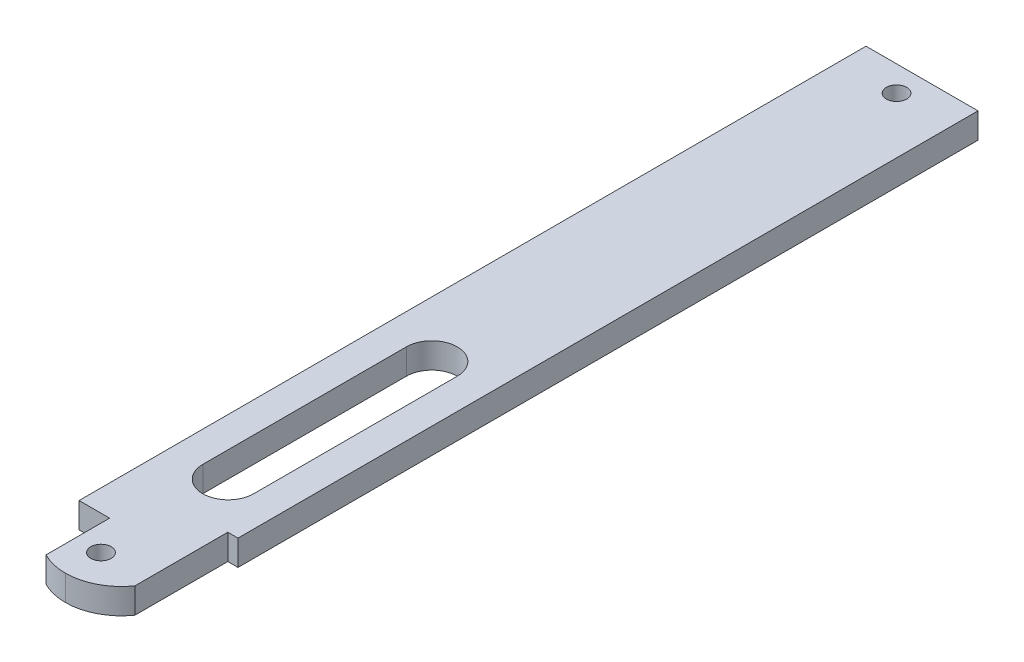
ISO-10303-21;
HEADER;
FILE_DESCRIPTION(('STEP AP214'),'2;1');
FILE_NAME('part.step','',(''),(''),'','','');
FILE_SCHEMA(('AUTOMOTIVE_DESIGN { 1 0 10303 214 1 1 1 1 }'));
ENDSEC;
DATA;
#1=APPLICATION_CONTEXT('core data for automotive mechanical design processes');
#2=APPLICATION_PROTOCOL_DEFINITION('international standard','automotive_design',2000,#1);
#3=PRODUCT_CONTEXT('',#1,'mechanical');
#4=PRODUCT('Part','Part','',(#3));
#5=PRODUCT_RELATED_PRODUCT_CATEGORY('part','',(#4));
#6=PRODUCT_DEFINITION_FORMATION('','',#4);
#7=PRODUCT_DEFINITION_CONTEXT('part definition',#1,'design');
#8=PRODUCT_DEFINITION('design','',#6,#7);
#9=PRODUCT_DEFINITION_SHAPE('','',#8);
#10=(LENGTH_UNIT() NAMED_UNIT(*) SI_UNIT(.MILLI.,.METRE.));
#11=(NAMED_UNIT(*) PLANE_ANGLE_UNIT() SI_UNIT($,.RADIAN.));
#12=(NAMED_UNIT(*) SI_UNIT($,.STERADIAN.) SOLID_ANGLE_UNIT());
#13=UNCERTAINTY_MEASURE_WITH_UNIT(LENGTH_MEASURE(1.E-05),#10,'distance_accuracy_value','');
#14=(GEOMETRIC_REPRESENTATION_CONTEXT(3) GLOBAL_UNCERTAINTY_ASSIGNED_CONTEXT((#13)) GLOBAL_UNIT_ASSIGNED_CONTEXT((#10,
#11,#12)) REPRESENTATION_CONTEXT('',''));
#15=CARTESIAN_POINT('',(0.,0.,0.));
#16=DIRECTION('',(0.,0.,1.));
#17=DIRECTION('',(1.,0.,0.));
#18=AXIS2_PLACEMENT_3D('',#15,#16,#17);
#19=CARTESIAN_POINT('',(0.,5.,0.));
#20=DIRECTION('',(-1.,0.,0.));
#21=DIRECTION('',(0.,0.,1.));
#22=AXIS2_PLACEMENT_3D('',#19,#20,#21);
#23=PLANE('',#22);
#24=DIRECTION('',(0.,-1.,0.));
#25=VECTOR('',#24,1.);
#26=CARTESIAN_POINT('',(0.,0.,-11.6998848399623));
#27=LINE('',#26,#25);
#28=CARTESIAN_POINT('',(0.,5.,-11.6998848399623));
#29=VERTEX_POINT('',#28);
#30=CARTESIAN_POINT('',(0.,0.,-11.6998848399623));
#31=VERTEX_POINT('',#30);
#32=EDGE_CURVE('E214',#29,#31,#27,.T.);
#33=ORIENTED_EDGE('',*,*,#32,.F.);
#34=DIRECTION('',(0.,0.,-1.));
#35=VECTOR('',#34,1.);
#36=CARTESIAN_POINT('',(0.,5.,0.));
#37=LINE('',#36,#35);
#38=CARTESIAN_POINT('',(0.,5.,-166.3));
#39=VERTEX_POINT('',#38);
#40=EDGE_CURVE('E270',#29,#39,#37,.T.);
#41=ORIENTED_EDGE('',*,*,#40,.T.);
#42=DIRECTION('',(0.,-1.,0.));
#43=VECTOR('',#42,1.);
#44=CARTESIAN_POINT('',(0.,5.,-166.3));
#45=LINE('',#44,#43);
#46=CARTESIAN_POINT('',(0.,0.,-166.3));
#47=VERTEX_POINT('',#46);
#48=EDGE_CURVE('E275',#39,#47,#45,.T.);
#49=ORIENTED_EDGE('',*,*,#48,.T.);
#50=DIRECTION('',(0.,0.,-1.));
#51=VECTOR('',#50,1.);
#52=CARTESIAN_POINT('',(0.,0.,0.));
#53=LINE('',#52,#51);
#54=EDGE_CURVE('E283',#31,#47,#53,.T.);
#55=ORIENTED_EDGE('',*,*,#54,.F.);
#56=EDGE_LOOP('',(#33,#41,#49,#55));
#57=FACE_BOUND('',#56,.T.);
#58=ADVANCED_FACE('F95',(#57),#23,.T.);
#59=CARTESIAN_POINT('',(22.,5.,0.));
#60=DIRECTION('',(-1.,0.,0.));
#61=DIRECTION('',(0.,0.,1.));
#62=AXIS2_PLACEMENT_3D('',#59,#60,#61);
#63=PLANE('',#62);
#64=DIRECTION('',(0.,0.,-1.));
#65=VECTOR('',#64,1.);
#66=CARTESIAN_POINT('',(22.,5.,0.));
#67=LINE('',#66,#65);
#68=CARTESIAN_POINT('',(22.,5.,-20.917059784221));
#69=VERTEX_POINT('',#68);
#70=CARTESIAN_POINT('',(22.,5.,-166.3));
#71=VERTEX_POINT('',#70);
#72=EDGE_CURVE('E264',#69,#71,#67,.T.);
#73=ORIENTED_EDGE('',*,*,#72,.F.);
#74=DIRECTION('',(0.,1.,0.));
#75=VECTOR('',#74,1.);
#76=CARTESIAN_POINT('',(22.,5.,-20.917059784221));
#77=LINE('',#76,#75);
#78=CARTESIAN_POINT('',(22.,0.,-20.917059784221));
#79=VERTEX_POINT('',#78);
#80=EDGE_CURVE('E196',#79,#69,#77,.T.);
#81=ORIENTED_EDGE('',*,*,#80,.F.);
#82=DIRECTION('',(0.,0.,-1.));
#83=VECTOR('',#82,1.);
#84=CARTESIAN_POINT('',(22.,0.,0.));
#85=LINE('',#84,#83);
#86=CARTESIAN_POINT('',(22.,0.,-166.3));
#87=VERTEX_POINT('',#86);
#88=EDGE_CURVE('E278',#79,#87,#85,.T.);
#89=ORIENTED_EDGE('',*,*,#88,.T.);
#90=DIRECTION('',(0.,-1.,0.));
#91=VECTOR('',#90,1.);
#92=CARTESIAN_POINT('',(22.,5.,-166.3));
#93=LINE('',#92,#91);
#94=EDGE_CURVE('E289',#71,#87,#93,.T.);
#95=ORIENTED_EDGE('',*,*,#94,.F.);
#96=EDGE_LOOP('',(#73,#81,#89,#95));
#97=FACE_BOUND('',#96,.T.);
#98=ADVANCED_FACE('F317',(#97),#63,.F.);
#99=CARTESIAN_POINT('',(0.,0.,0.));
#100=DIRECTION('',(0.,1.,0.));
#101=DIRECTION('',(0.,0.,1.));
#102=AXIS2_PLACEMENT_3D('',#99,#100,#101);
#103=PLANE('',#102);
#104=CARTESIAN_POINT('',(11.,0.,-5.));
#105=DIRECTION('',(0.,1.,0.));
#106=DIRECTION('',(0.,0.,1.));
#107=AXIS2_PLACEMENT_3D('',#104,#105,#106);
#108=CIRCLE('',#107,2.);
#109=CARTESIAN_POINT('',(11.,0.,-3.));
#110=VERTEX_POINT('',#109);
#111=EDGE_CURVE('E265',#110,#110,#108,.T.);
#112=ORIENTED_EDGE('',*,*,#111,.T.);
#113=EDGE_LOOP('',(#112));
#114=FACE_BOUND('',#113,.T.);
#115=CARTESIAN_POINT('',(11.,0.,-161.3));
#116=DIRECTION('',(0.,1.,0.));
#117=DIRECTION('',(0.,0.,1.));
#118=AXIS2_PLACEMENT_3D('',#115,#116,#117);
#119=CIRCLE('',#118,2.);
#120=CARTESIAN_POINT('',(11.,0.,-159.3));
#121=VERTEX_POINT('',#120);
#122=EDGE_CURVE('E254',#121,#121,#119,.T.);
#123=ORIENTED_EDGE('',*,*,#122,.T.);
#124=EDGE_LOOP('',(#123));
#125=FACE_BOUND('',#124,.T.);
#126=CARTESIAN_POINT('',(11.,0.,-70.));
#127=DIRECTION('',(0.,-1.,0.));
#128=DIRECTION('',(0.,0.,-1.));
#129=AXIS2_PLACEMENT_3D('',#126,#127,#128);
#130=CIRCLE('',#129,5.);
#131=CARTESIAN_POINT('',(6.,0.,-70.));
#132=VERTEX_POINT('',#131);
#133=CARTESIAN_POINT('',(16.,0.,-70.));
#134=VERTEX_POINT('',#133);
#135=EDGE_CURVE('E244',#132,#134,#130,.T.);
#136=ORIENTED_EDGE('',*,*,#135,.F.);
#137=DIRECTION('',(0.,0.,-1.));
#138=VECTOR('',#137,1.);
#139=CARTESIAN_POINT('',(6.,0.,0.));
#140=LINE('',#139,#138);
#141=CARTESIAN_POINT('',(6.,0.,-30.));
#142=VERTEX_POINT('',#141);
#143=EDGE_CURVE('E242',#142,#132,#140,.T.);
#144=ORIENTED_EDGE('',*,*,#143,.F.);
#145=CARTESIAN_POINT('',(11.,0.,-30.));
#146=DIRECTION('',(0.,-1.,0.));
#147=DIRECTION('',(0.,0.,-1.));
#148=AXIS2_PLACEMENT_3D('',#145,#146,#147);
#149=CIRCLE('',#148,5.);
#150=CARTESIAN_POINT('',(16.,0.,-30.));
#151=VERTEX_POINT('',#150);
#152=EDGE_CURVE('E232',#151,#142,#149,.T.);
#153=ORIENTED_EDGE('',*,*,#152,.F.);
#154=DIRECTION('',(0.,0.,-1.));
#155=VECTOR('',#154,1.);
#156=CARTESIAN_POINT('',(16.,0.,0.));
#157=LINE('',#156,#155);
#158=EDGE_CURVE('E247',#151,#134,#157,.T.);
#159=ORIENTED_EDGE('',*,*,#158,.T.);
#160=EDGE_LOOP('',(#136,#144,#153,#159));
#161=FACE_BOUND('',#160,.T.);
#162=ORIENTED_EDGE('',*,*,#88,.F.);
#163=DIRECTION('',(1.,0.,0.));
#164=VECTOR('',#163,1.);
#165=CARTESIAN_POINT('',(20.,0.,-20.917059784221));
#166=LINE('',#165,#164);
#167=CARTESIAN_POINT('',(20.,0.,-20.917059784221));
#168=VERTEX_POINT('',#167);
#169=EDGE_CURVE('E199',#168,#79,#166,.T.);
#170=ORIENTED_EDGE('',*,*,#169,.F.);
#171=DIRECTION('',(0.,0.,-1.));
#172=VECTOR('',#171,1.);
#173=CARTESIAN_POINT('',(20.,0.,-20.917059784221));
#174=LINE('',#173,#172);
#175=CARTESIAN_POINT('',(20.,0.,-2.67544467966324));
#176=VERTEX_POINT('',#175);
#177=EDGE_CURVE('E200',#176,#168,#174,.T.);
#178=ORIENTED_EDGE('',*,*,#177,.F.);
#179=CARTESIAN_POINT('',(11.,0.,-9.));
#180=DIRECTION('',(0.,1.,0.));
#181=DIRECTION('',(0.,0.,1.));
#182=AXIS2_PLACEMENT_3D('',#179,#180,#181);
#183=CIRCLE('',#182,11.);
#184=CARTESIAN_POINT('',(11.,0.,2.));
#185=VERTEX_POINT('',#184);
#186=EDGE_CURVE('E292',#176,#185,#183,.F.);
#187=ORIENTED_EDGE('',*,*,#186,.T.);
#188=CARTESIAN_POINT('',(11.,0.,-9.));
#189=DIRECTION('',(0.,1.,0.));
#190=DIRECTION('',(0.,0.,1.));
#191=AXIS2_PLACEMENT_3D('',#188,#189,#190);
#192=CIRCLE('',#191,11.);
#193=CARTESIAN_POINT('',(6.,0.,0.797958971132712));
#194=VERTEX_POINT('',#193);
#195=EDGE_CURVE('E294',#185,#194,#192,.F.);
#196=ORIENTED_EDGE('',*,*,#195,.T.);
#197=DIRECTION('',(0.,0.,1.));
#198=VECTOR('',#197,1.);
#199=CARTESIAN_POINT('',(6.,0.,-11.6998848399623));
#200=LINE('',#199,#198);
#201=CARTESIAN_POINT('',(6.,0.,-11.6998848399623));
#202=VERTEX_POINT('',#201);
#203=EDGE_CURVE('E117',#202,#194,#200,.T.);
#204=ORIENTED_EDGE('',*,*,#203,.F.);
#205=DIRECTION('',(-1.,0.,0.));
#206=VECTOR('',#205,1.);
#207=CARTESIAN_POINT('',(6.,0.,-11.6998848399623));
#208=LINE('',#207,#206);
#209=EDGE_CURVE('E221',#202,#31,#208,.T.);
#210=ORIENTED_EDGE('',*,*,#209,.T.);
#211=ORIENTED_EDGE('',*,*,#54,.T.);
#212=DIRECTION('',(1.,0.,0.));
#213=VECTOR('',#212,1.);
#214=CARTESIAN_POINT('',(0.,0.,-166.3));
#215=LINE('',#214,#213);
#216=EDGE_CURVE('E280',#47,#87,#215,.T.);
#217=ORIENTED_EDGE('',*,*,#216,.T.);
#218=EDGE_LOOP('',(#162,#170,#178,#187,#196,#204,#210,#211,#217));
#219=FACE_BOUND('',#218,.T.);
#220=ADVANCED_FACE('F315',(#114,#125,#161,#219),#103,.F.);
#221=CARTESIAN_POINT('',(0.,5.,0.));
#222=DIRECTION('',(0.,1.,0.));
#223=DIRECTION('',(0.,0.,1.));
#224=AXIS2_PLACEMENT_3D('',#221,#222,#223);
#225=PLANE('',#224);
#226=DIRECTION('',(1.,0.,0.));
#227=VECTOR('',#226,1.);
#228=CARTESIAN_POINT('',(20.,5.,-20.917059784221));
#229=LINE('',#228,#227);
#230=CARTESIAN_POINT('',(20.,5.,-20.917059784221));
#231=VERTEX_POINT('',#230);
#232=EDGE_CURVE('E191',#231,#69,#229,.T.);
#233=ORIENTED_EDGE('',*,*,#232,.T.);
#234=ORIENTED_EDGE('',*,*,#72,.T.);
#235=DIRECTION('',(1.,0.,0.));
#236=VECTOR('',#235,1.);
#237=CARTESIAN_POINT('',(0.,5.,-166.3));
#238=LINE('',#237,#236);
#239=EDGE_CURVE('E267',#39,#71,#238,.T.);
#240=ORIENTED_EDGE('',*,*,#239,.F.);
#241=ORIENTED_EDGE('',*,*,#40,.F.);
#242=DIRECTION('',(-1.,0.,0.));
#243=VECTOR('',#242,1.);
#244=CARTESIAN_POINT('',(6.,5.,-11.6998848399623));
#245=LINE('',#244,#243);
#246=CARTESIAN_POINT('',(6.,5.,-11.6998848399623));
#247=VERTEX_POINT('',#246);
#248=EDGE_CURVE('E223',#247,#29,#245,.T.);
#249=ORIENTED_EDGE('',*,*,#248,.F.);
#250=DIRECTION('',(0.,0.,-1.));
#251=VECTOR('',#250,1.);
#252=CARTESIAN_POINT('',(6.,5.,-11.6998848399623));
#253=LINE('',#252,#251);
#254=CARTESIAN_POINT('',(6.,5.,0.797958971132714));
#255=VERTEX_POINT('',#254);
#256=EDGE_CURVE('E219',#255,#247,#253,.T.);
#257=ORIENTED_EDGE('',*,*,#256,.F.);
#258=CARTESIAN_POINT('',(11.,5.,-9.));
#259=DIRECTION('',(0.,1.,0.));
#260=DIRECTION('',(0.,0.,1.));
#261=AXIS2_PLACEMENT_3D('',#258,#259,#260);
#262=CIRCLE('',#261,11.);
#263=CARTESIAN_POINT('',(11.,5.,2.));
#264=VERTEX_POINT('',#263);
#265=EDGE_CURVE('E298',#255,#264,#262,.T.);
#266=ORIENTED_EDGE('',*,*,#265,.T.);
#267=CARTESIAN_POINT('',(11.,5.,-9.));
#268=DIRECTION('',(0.,1.,0.));
#269=DIRECTION('',(0.,0.,1.));
#270=AXIS2_PLACEMENT_3D('',#267,#268,#269);
#271=CIRCLE('',#270,11.);
#272=CARTESIAN_POINT('',(20.,5.,-2.67544467966324));
#273=VERTEX_POINT('',#272);
#274=EDGE_CURVE('E209',#264,#273,#271,.T.);
#275=ORIENTED_EDGE('',*,*,#274,.T.);
#276=DIRECTION('',(0.,0.,1.));
#277=VECTOR('',#276,1.);
#278=CARTESIAN_POINT('',(20.,5.,-20.917059784221));
#279=LINE('',#278,#277);
#280=EDGE_CURVE('E109',#231,#273,#279,.T.);
#281=ORIENTED_EDGE('',*,*,#280,.F.);
#282=EDGE_LOOP('',(#233,#234,#240,#241,#249,#257,#266,#275,#281));
#283=FACE_BOUND('',#282,.T.);
#284=DIRECTION('',(0.,0.,-1.));
#285=VECTOR('',#284,1.);
#286=CARTESIAN_POINT('',(6.,5.,0.));
#287=LINE('',#286,#285);
#288=CARTESIAN_POINT('',(6.,5.,-30.));
#289=VERTEX_POINT('',#288);
#290=CARTESIAN_POINT('',(6.,5.,-70.));
#291=VERTEX_POINT('',#290);
#292=EDGE_CURVE('E228',#289,#291,#287,.T.);
#293=ORIENTED_EDGE('',*,*,#292,.T.);
#294=CARTESIAN_POINT('',(11.,5.,-70.));
#295=DIRECTION('',(0.,-1.,0.));
#296=DIRECTION('',(0.,0.,-1.));
#297=AXIS2_PLACEMENT_3D('',#294,#295,#296);
#298=CIRCLE('',#297,5.);
#299=CARTESIAN_POINT('',(16.,5.,-70.));
#300=VERTEX_POINT('',#299);
#301=EDGE_CURVE('E231',#291,#300,#298,.T.);
#302=ORIENTED_EDGE('',*,*,#301,.T.);
#303=DIRECTION('',(0.,0.,-1.));
#304=VECTOR('',#303,1.);
#305=CARTESIAN_POINT('',(16.,5.,0.));
#306=LINE('',#305,#304);
#307=CARTESIAN_POINT('',(16.,5.,-30.));
#308=VERTEX_POINT('',#307);
#309=EDGE_CURVE('E235',#308,#300,#306,.T.);
#310=ORIENTED_EDGE('',*,*,#309,.F.);
#311=CARTESIAN_POINT('',(11.,5.,-30.));
#312=DIRECTION('',(0.,-1.,0.));
#313=DIRECTION('',(0.,0.,-1.));
#314=AXIS2_PLACEMENT_3D('',#311,#312,#313);
#315=CIRCLE('',#314,5.);
#316=EDGE_CURVE('E238',#308,#289,#315,.T.);
#317=ORIENTED_EDGE('',*,*,#316,.T.);
#318=EDGE_LOOP('',(#293,#302,#310,#317));
#319=FACE_BOUND('',#318,.T.);
#320=CARTESIAN_POINT('',(11.,5.,-161.3));
#321=DIRECTION('',(0.,1.,0.));
#322=DIRECTION('',(0.,0.,1.));
#323=AXIS2_PLACEMENT_3D('',#320,#321,#322);
#324=CIRCLE('',#323,2.);
#325=CARTESIAN_POINT('',(11.,5.,-159.3));
#326=VERTEX_POINT('',#325);
#327=EDGE_CURVE('E261',#326,#326,#324,.T.);
#328=ORIENTED_EDGE('',*,*,#327,.F.);
#329=EDGE_LOOP('',(#328));
#330=FACE_BOUND('',#329,.T.);
#331=CARTESIAN_POINT('',(11.,5.,-5.));
#332=DIRECTION('',(0.,1.,0.));
#333=DIRECTION('',(0.,0.,1.));
#334=AXIS2_PLACEMENT_3D('',#331,#332,#333);
#335=CIRCLE('',#334,2.);
#336=CARTESIAN_POINT('',(11.,5.,-3.));
#337=VERTEX_POINT('',#336);
#338=EDGE_CURVE('E272',#337,#337,#335,.T.);
#339=ORIENTED_EDGE('',*,*,#338,.F.);
#340=EDGE_LOOP('',(#339));
#341=FACE_BOUND('',#340,.T.);
#342=ADVANCED_FACE('F206',(#283,#319,#330,#341),#225,.T.);
#343=CARTESIAN_POINT('',(11.,5.,-5.));
#344=DIRECTION('',(0.,-1.,0.));
#345=DIRECTION('',(0.,0.,-1.));
#346=AXIS2_PLACEMENT_3D('',#343,#344,#345);
#347=CYLINDRICAL_SURFACE('',#346,2.);
#348=ORIENTED_EDGE('',*,*,#338,.T.);
#349=EDGE_LOOP('',(#348));
#350=FACE_BOUND('',#349,.T.);
#351=ORIENTED_EDGE('',*,*,#111,.F.);
#352=EDGE_LOOP('',(#351));
#353=FACE_BOUND('',#352,.T.);
#354=ADVANCED_FACE('F346',(#350,#353),#347,.F.);
#355=CARTESIAN_POINT('',(0.,5.,-166.3));
#356=DIRECTION('',(0.,0.,-1.));
#357=DIRECTION('',(-1.,0.,0.));
#358=AXIS2_PLACEMENT_3D('',#355,#356,#357);
#359=PLANE('',#358);
#360=ORIENTED_EDGE('',*,*,#216,.F.);
#361=ORIENTED_EDGE('',*,*,#48,.F.);
#362=ORIENTED_EDGE('',*,*,#239,.T.);
#363=ORIENTED_EDGE('',*,*,#94,.T.);
#364=EDGE_LOOP('',(#360,#361,#362,#363));
#365=FACE_BOUND('',#364,.T.);
#366=ADVANCED_FACE('F323',(#365),#359,.T.);
#367=CARTESIAN_POINT('',(11.,5.,-161.3));
#368=DIRECTION('',(0.,-1.,0.));
#369=DIRECTION('',(0.,0.,-1.));
#370=AXIS2_PLACEMENT_3D('',#367,#368,#369);
#371=CYLINDRICAL_SURFACE('',#370,2.);
#372=ORIENTED_EDGE('',*,*,#327,.T.);
#373=EDGE_LOOP('',(#372));
#374=FACE_BOUND('',#373,.T.);
#375=ORIENTED_EDGE('',*,*,#122,.F.);
#376=EDGE_LOOP('',(#375));
#377=FACE_BOUND('',#376,.T.);
#378=ADVANCED_FACE('F349',(#374,#377),#371,.F.);
#379=CARTESIAN_POINT('',(6.,5.,0.));
#380=DIRECTION('',(-1.,0.,0.));
#381=DIRECTION('',(0.,0.,1.));
#382=AXIS2_PLACEMENT_3D('',#379,#380,#381);
#383=PLANE('',#382);
#384=ORIENTED_EDGE('',*,*,#143,.T.);
#385=DIRECTION('',(0.,-1.,0.));
#386=VECTOR('',#385,1.);
#387=CARTESIAN_POINT('',(6.,5.,-70.));
#388=LINE('',#387,#386);
#389=EDGE_CURVE('E241',#291,#132,#388,.T.);
#390=ORIENTED_EDGE('',*,*,#389,.F.);
#391=ORIENTED_EDGE('',*,*,#292,.F.);
#392=DIRECTION('',(0.,-1.,0.));
#393=VECTOR('',#392,1.);
#394=CARTESIAN_POINT('',(6.,5.,-30.));
#395=LINE('',#394,#393);
#396=EDGE_CURVE('E252',#289,#142,#395,.T.);
#397=ORIENTED_EDGE('',*,*,#396,.T.);
#398=EDGE_LOOP('',(#384,#390,#391,#397));
#399=FACE_BOUND('',#398,.T.);
#400=ADVANCED_FACE('F352',(#399),#383,.F.);
#401=CARTESIAN_POINT('',(11.,5.,-30.));
#402=DIRECTION('',(0.,-1.,0.));
#403=DIRECTION('',(0.,0.,-1.));
#404=AXIS2_PLACEMENT_3D('',#401,#402,#403);
#405=CYLINDRICAL_SURFACE('',#404,5.);
#406=ORIENTED_EDGE('',*,*,#152,.T.);
#407=ORIENTED_EDGE('',*,*,#396,.F.);
#408=ORIENTED_EDGE('',*,*,#316,.F.);
#409=DIRECTION('',(0.,-1.,0.));
#410=VECTOR('',#409,1.);
#411=CARTESIAN_POINT('',(16.,5.,-30.));
#412=LINE('',#411,#410);
#413=EDGE_CURVE('E255',#308,#151,#412,.T.);
#414=ORIENTED_EDGE('',*,*,#413,.T.);
#415=EDGE_LOOP('',(#406,#407,#408,#414));
#416=FACE_BOUND('',#415,.T.);
#417=ADVANCED_FACE('F357',(#416),#405,.F.);
#418=CARTESIAN_POINT('',(16.,5.,0.));
#419=DIRECTION('',(-1.,0.,0.));
#420=DIRECTION('',(0.,0.,1.));
#421=AXIS2_PLACEMENT_3D('',#418,#419,#420);
#422=PLANE('',#421);
#423=ORIENTED_EDGE('',*,*,#158,.F.);
#424=ORIENTED_EDGE('',*,*,#413,.F.);
#425=ORIENTED_EDGE('',*,*,#309,.T.);
#426=DIRECTION('',(0.,-1.,0.));
#427=VECTOR('',#426,1.);
#428=CARTESIAN_POINT('',(16.,5.,-70.));
#429=LINE('',#428,#427);
#430=EDGE_CURVE('E257',#300,#134,#429,.T.);
#431=ORIENTED_EDGE('',*,*,#430,.T.);
#432=EDGE_LOOP('',(#423,#424,#425,#431));
#433=FACE_BOUND('',#432,.T.);
#434=ADVANCED_FACE('F379',(#433),#422,.T.);
#435=CARTESIAN_POINT('',(11.,5.,-70.));
#436=DIRECTION('',(0.,-1.,0.));
#437=DIRECTION('',(0.,0.,-1.));
#438=AXIS2_PLACEMENT_3D('',#435,#436,#437);
#439=CYLINDRICAL_SURFACE('',#438,5.);
#440=ORIENTED_EDGE('',*,*,#135,.T.);
#441=ORIENTED_EDGE('',*,*,#430,.F.);
#442=ORIENTED_EDGE('',*,*,#301,.F.);
#443=ORIENTED_EDGE('',*,*,#389,.T.);
#444=EDGE_LOOP('',(#440,#441,#442,#443));
#445=FACE_BOUND('',#444,.T.);
#446=ADVANCED_FACE('F372',(#445),#439,.F.);
#447=CARTESIAN_POINT('',(11.,0.,-9.));
#448=DIRECTION('',(0.,-1.,0.));
#449=DIRECTION('',(0.,0.,-1.));
#450=AXIS2_PLACEMENT_3D('',#447,#448,#449);
#451=CYLINDRICAL_SURFACE('',#450,11.);
#452=DIRECTION('',(0.,-1.,0.));
#453=VECTOR('',#452,1.);
#454=CARTESIAN_POINT('',(20.,0.,-2.67544467966324));
#455=LINE('',#454,#453);
#456=EDGE_CURVE('E12',#273,#176,#455,.T.);
#457=ORIENTED_EDGE('',*,*,#456,.F.);
#458=ORIENTED_EDGE('',*,*,#274,.F.);
#459=DIRECTION('',(0.,1.,0.));
#460=VECTOR('',#459,1.);
#461=CARTESIAN_POINT('',(11.,5.,2.));
#462=LINE('',#461,#460);
#463=EDGE_CURVE('E225',#185,#264,#462,.T.);
#464=ORIENTED_EDGE('',*,*,#463,.F.);
#465=ORIENTED_EDGE('',*,*,#186,.F.);
#466=EDGE_LOOP('',(#457,#458,#464,#465));
#467=FACE_BOUND('',#466,.T.);
#468=ADVANCED_FACE('F97',(#467),#451,.T.);
#469=CARTESIAN_POINT('',(11.,0.,-9.));
#470=DIRECTION('',(0.,-1.,0.));
#471=DIRECTION('',(0.,0.,-1.));
#472=AXIS2_PLACEMENT_3D('',#469,#470,#471);
#473=CYLINDRICAL_SURFACE('',#472,11.);
#474=DIRECTION('',(0.,-1.,0.));
#475=VECTOR('',#474,1.);
#476=CARTESIAN_POINT('',(6.,0.,0.797958971132714));
#477=LINE('',#476,#475);
#478=EDGE_CURVE('E103',#194,#255,#477,.F.);
#479=ORIENTED_EDGE('',*,*,#478,.F.);
#480=ORIENTED_EDGE('',*,*,#195,.F.);
#481=ORIENTED_EDGE('',*,*,#463,.T.);
#482=ORIENTED_EDGE('',*,*,#265,.F.);
#483=EDGE_LOOP('',(#479,#480,#481,#482));
#484=FACE_BOUND('',#483,.T.);
#485=ADVANCED_FACE('F309',(#484),#473,.T.);
#486=CARTESIAN_POINT('',(6.,0.,-11.6998848399623));
#487=DIRECTION('',(0.,0.,-1.));
#488=DIRECTION('',(-1.,0.,0.));
#489=AXIS2_PLACEMENT_3D('',#486,#487,#488);
#490=PLANE('',#489);
#491=ORIENTED_EDGE('',*,*,#32,.T.);
#492=ORIENTED_EDGE('',*,*,#209,.F.);
#493=DIRECTION('',(0.,-1.,0.));
#494=VECTOR('',#493,1.);
#495=CARTESIAN_POINT('',(6.,0.,-11.6998848399623));
#496=LINE('',#495,#494);
#497=EDGE_CURVE('E216',#247,#202,#496,.T.);
#498=ORIENTED_EDGE('',*,*,#497,.F.);
#499=ORIENTED_EDGE('',*,*,#248,.T.);
#500=EDGE_LOOP('',(#491,#492,#498,#499));
#501=FACE_BOUND('',#500,.T.);
#502=ADVANCED_FACE('F328',(#501),#490,.F.);
#503=CARTESIAN_POINT('',(6.,0.,0.));
#504=DIRECTION('',(1.,0.,0.));
#505=DIRECTION('',(0.,0.,-1.));
#506=AXIS2_PLACEMENT_3D('',#503,#504,#505);
#507=PLANE('',#506);
#508=ORIENTED_EDGE('',*,*,#478,.T.);
#509=ORIENTED_EDGE('',*,*,#256,.T.);
#510=ORIENTED_EDGE('',*,*,#497,.T.);
#511=ORIENTED_EDGE('',*,*,#203,.T.);
#512=EDGE_LOOP('',(#508,#509,#510,#511));
#513=FACE_BOUND('',#512,.T.);
#514=ADVANCED_FACE('F302',(#513),#507,.F.);
#515=CARTESIAN_POINT('',(20.,5.,-20.917059784221));
#516=DIRECTION('',(0.,0.,-1.));
#517=DIRECTION('',(-1.,0.,0.));
#518=AXIS2_PLACEMENT_3D('',#515,#516,#517);
#519=PLANE('',#518);
#520=ORIENTED_EDGE('',*,*,#80,.T.);
#521=ORIENTED_EDGE('',*,*,#232,.F.);
#522=DIRECTION('',(0.,1.,0.));
#523=VECTOR('',#522,1.);
#524=CARTESIAN_POINT('',(20.,5.,-20.917059784221));
#525=LINE('',#524,#523);
#526=EDGE_CURVE('E193',#168,#231,#525,.T.);
#527=ORIENTED_EDGE('',*,*,#526,.F.);
#528=ORIENTED_EDGE('',*,*,#169,.T.);
#529=EDGE_LOOP('',(#520,#521,#527,#528));
#530=FACE_BOUND('',#529,.T.);
#531=ADVANCED_FACE('F192',(#530),#519,.F.);
#532=CARTESIAN_POINT('',(20.,0.,0.));
#533=DIRECTION('',(-1.,0.,0.));
#534=DIRECTION('',(0.,0.,1.));
#535=AXIS2_PLACEMENT_3D('',#532,#533,#534);
#536=PLANE('',#535);
#537=ORIENTED_EDGE('',*,*,#456,.T.);
#538=ORIENTED_EDGE('',*,*,#177,.T.);
#539=ORIENTED_EDGE('',*,*,#526,.T.);
#540=ORIENTED_EDGE('',*,*,#280,.T.);
#541=EDGE_LOOP('',(#537,#538,#539,#540));
#542=FACE_BOUND('',#541,.T.);
#543=ADVANCED_FACE('F202',(#542),#536,.F.);
#544=CLOSED_SHELL('',(#58,#98,#220,#342,#354,#366,#378,#400,#417,#434,#446,#468,#485,#502,#514,
#531,#543));
#545=MANIFOLD_SOLID_BREP('B2',#544);
#546=ADVANCED_BREP_SHAPE_REPRESENTATION('',(#18,#545),#14);
#547=SHAPE_DEFINITION_REPRESENTATION(#9,#546);
ENDSEC;
END-ISO-10303-21;
